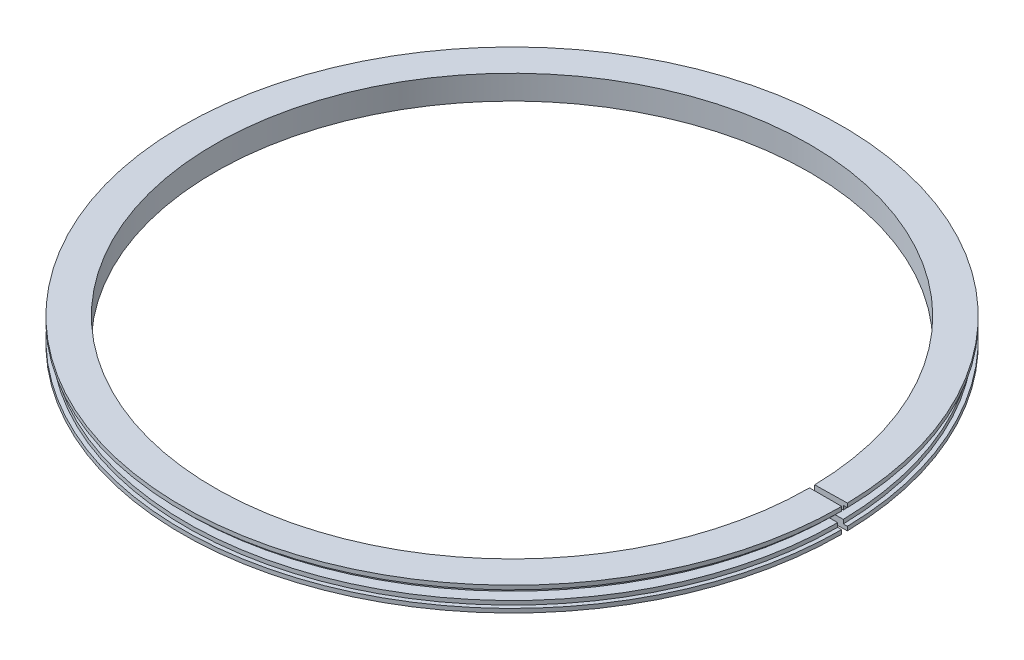
ISO-10303-21;
HEADER;
FILE_DESCRIPTION(('STEP AP214'),'2;1');
FILE_NAME('part.step','',(''),(''),'','','');
FILE_SCHEMA(('AUTOMOTIVE_DESIGN { 1 0 10303 214 1 1 1 1 }'));
ENDSEC;
DATA;
#1=APPLICATION_CONTEXT('core data for automotive mechanical design processes');
#2=APPLICATION_PROTOCOL_DEFINITION('international standard','automotive_design',2000,#1);
#3=PRODUCT_CONTEXT('',#1,'mechanical');
#4=PRODUCT('Part','Part','',(#3));
#5=PRODUCT_RELATED_PRODUCT_CATEGORY('part','',(#4));
#6=PRODUCT_DEFINITION_FORMATION('','',#4);
#7=PRODUCT_DEFINITION_CONTEXT('part definition',#1,'design');
#8=PRODUCT_DEFINITION('design','',#6,#7);
#9=PRODUCT_DEFINITION_SHAPE('','',#8);
#10=(LENGTH_UNIT() NAMED_UNIT(*) SI_UNIT(.MILLI.,.METRE.));
#11=(NAMED_UNIT(*) PLANE_ANGLE_UNIT() SI_UNIT($,.RADIAN.));
#12=(NAMED_UNIT(*) SI_UNIT($,.STERADIAN.) SOLID_ANGLE_UNIT());
#13=UNCERTAINTY_MEASURE_WITH_UNIT(LENGTH_MEASURE(1.E-05),#10,'distance_accuracy_value','');
#14=(GEOMETRIC_REPRESENTATION_CONTEXT(3) GLOBAL_UNCERTAINTY_ASSIGNED_CONTEXT((#13)) GLOBAL_UNIT_ASSIGNED_CONTEXT((#10,
#11,#12)) REPRESENTATION_CONTEXT('',''));
#15=CARTESIAN_POINT('',(0.,0.,0.));
#16=DIRECTION('',(0.,0.,1.));
#17=DIRECTION('',(1.,0.,0.));
#18=AXIS2_PLACEMENT_3D('',#15,#16,#17);
#19=CARTESIAN_POINT('',(38.4941362635211,2.,-0.67191764783487));
#20=DIRECTION('',(0.,1.,0.));
#21=DIRECTION('',(0.,0.,1.));
#22=AXIS2_PLACEMENT_3D('',#19,#20,#21);
#23=PLANE('',#22);
#24=CARTESIAN_POINT('',(0.,2.,0.));
#25=DIRECTION('',(0.,1.,0.));
#26=DIRECTION('',(0.,0.,1.));
#27=AXIS2_PLACEMENT_3D('',#24,#25,#26);
#28=CIRCLE('',#27,38.5);
#29=CARTESIAN_POINT('',(38.4941362635211,2.,-0.67191764783487));
#30=VERTEX_POINT('',#29);
#31=CARTESIAN_POINT('',(38.5,2.,0.));
#32=VERTEX_POINT('',#31);
#33=EDGE_CURVE('E11',#30,#32,#28,.T.);
#34=ORIENTED_EDGE('',*,*,#33,.T.);
#35=DIRECTION('',(1.,0.,0.));
#36=VECTOR('',#35,1.);
#37=CARTESIAN_POINT('',(38.5,2.,0.));
#38=LINE('',#37,#36);
#39=CARTESIAN_POINT('',(40.5,2.,0.));
#40=VERTEX_POINT('',#39);
#41=EDGE_CURVE('E149',#32,#40,#38,.T.);
#42=ORIENTED_EDGE('',*,*,#41,.T.);
#43=CARTESIAN_POINT('',(0.,2.,0.));
#44=DIRECTION('',(0.,1.,0.));
#45=DIRECTION('',(0.,0.,1.));
#46=AXIS2_PLACEMENT_3D('',#43,#44,#45);
#47=CIRCLE('',#46,40.5);
#48=CARTESIAN_POINT('',(40.4938316538339,2.,-0.706822460709409));
#49=VERTEX_POINT('',#48);
#50=EDGE_CURVE('E130',#49,#40,#47,.T.);
#51=ORIENTED_EDGE('',*,*,#50,.F.);
#52=DIRECTION('',(0.999847695156391,0.,-0.0174524064372693));
#53=VECTOR('',#52,1.);
#54=CARTESIAN_POINT('',(38.4941362635211,2.,-0.67191764783487));
#55=LINE('',#54,#53);
#56=EDGE_CURVE('E195',#30,#49,#55,.T.);
#57=ORIENTED_EDGE('',*,*,#56,.F.);
#58=EDGE_LOOP('',(#34,#42,#51,#57));
#59=FACE_BOUND('',#58,.T.);
#60=ADVANCED_FACE('F41',(#59),#23,.F.);
#61=CARTESIAN_POINT('',(0.,14.4931348475547,0.));
#62=DIRECTION('',(0.,1.,0.));
#63=DIRECTION('',(0.,0.,1.));
#64=AXIS2_PLACEMENT_3D('',#61,#62,#63);
#65=CYLINDRICAL_SURFACE('',#64,38.5);
#66=CARTESIAN_POINT('',(0.,1.,0.));
#67=DIRECTION('',(0.,1.,0.));
#68=DIRECTION('',(0.,0.,1.));
#69=AXIS2_PLACEMENT_3D('',#66,#67,#68);
#70=CIRCLE('',#69,38.5);
#71=CARTESIAN_POINT('',(38.4941362635211,1.,-0.67191764783487));
#72=VERTEX_POINT('',#71);
#73=CARTESIAN_POINT('',(38.5,1.,0.));
#74=VERTEX_POINT('',#73);
#75=EDGE_CURVE('E50',#72,#74,#70,.T.);
#76=ORIENTED_EDGE('',*,*,#75,.T.);
#77=DIRECTION('',(0.,1.,0.));
#78=VECTOR('',#77,1.);
#79=CARTESIAN_POINT('',(38.5,2.,0.));
#80=LINE('',#79,#78);
#81=EDGE_CURVE('E192',#74,#32,#80,.T.);
#82=ORIENTED_EDGE('',*,*,#81,.T.);
#83=ORIENTED_EDGE('',*,*,#33,.F.);
#84=DIRECTION('',(0.,1.,0.));
#85=VECTOR('',#84,1.);
#86=CARTESIAN_POINT('',(38.4941362635211,2.,-0.67191764783487));
#87=LINE('',#86,#85);
#88=EDGE_CURVE('E143',#72,#30,#87,.T.);
#89=ORIENTED_EDGE('',*,*,#88,.F.);
#90=EDGE_LOOP('',(#76,#82,#83,#89));
#91=FACE_BOUND('',#90,.T.);
#92=ADVANCED_FACE('F43',(#91),#65,.T.);
#93=CARTESIAN_POINT('',(38.4941362635211,1.,-0.67191764783487));
#94=DIRECTION('',(0.,-1.,0.));
#95=DIRECTION('',(0.,0.,-1.));
#96=AXIS2_PLACEMENT_3D('',#93,#94,#95);
#97=PLANE('',#96);
#98=CARTESIAN_POINT('',(0.,1.,0.));
#99=DIRECTION('',(0.,1.,0.));
#100=DIRECTION('',(0.,0.,1.));
#101=AXIS2_PLACEMENT_3D('',#98,#99,#100);
#102=CIRCLE('',#101,40.5);
#103=CARTESIAN_POINT('',(40.4938316538339,1.,-0.706822460709409));
#104=VERTEX_POINT('',#103);
#105=CARTESIAN_POINT('',(40.5,1.,0.));
#106=VERTEX_POINT('',#105);
#107=EDGE_CURVE('E260',#104,#106,#102,.T.);
#108=ORIENTED_EDGE('',*,*,#107,.T.);
#109=DIRECTION('',(-1.,0.,0.));
#110=VECTOR('',#109,1.);
#111=CARTESIAN_POINT('',(38.5,1.,0.));
#112=LINE('',#111,#110);
#113=EDGE_CURVE('E189',#106,#74,#112,.T.);
#114=ORIENTED_EDGE('',*,*,#113,.T.);
#115=ORIENTED_EDGE('',*,*,#75,.F.);
#116=DIRECTION('',(-0.999847695156391,0.,0.0174524064372693));
#117=VECTOR('',#116,1.);
#118=CARTESIAN_POINT('',(38.4941362635211,1.,-0.67191764783487));
#119=LINE('',#118,#117);
#120=EDGE_CURVE('E232',#104,#72,#119,.T.);
#121=ORIENTED_EDGE('',*,*,#120,.F.);
#122=EDGE_LOOP('',(#108,#114,#115,#121));
#123=FACE_BOUND('',#122,.T.);
#124=ADVANCED_FACE('F265',(#123),#97,.F.);
#125=CARTESIAN_POINT('',(0.,14.4931348475547,0.));
#126=DIRECTION('',(0.,1.,0.));
#127=DIRECTION('',(0.,0.,1.));
#128=AXIS2_PLACEMENT_3D('',#125,#126,#127);
#129=CYLINDRICAL_SURFACE('',#128,40.5);
#130=CARTESIAN_POINT('',(0.,0.5,0.));
#131=DIRECTION('',(0.,1.,0.));
#132=DIRECTION('',(0.,0.,1.));
#133=AXIS2_PLACEMENT_3D('',#130,#131,#132);
#134=CIRCLE('',#133,40.5);
#135=CARTESIAN_POINT('',(40.4938316538339,0.500000000000001,-0.706822460709409));
#136=VERTEX_POINT('',#135);
#137=CARTESIAN_POINT('',(40.5,0.500000000000001,0.));
#138=VERTEX_POINT('',#137);
#139=EDGE_CURVE('E257',#136,#138,#134,.T.);
#140=ORIENTED_EDGE('',*,*,#139,.T.);
#141=DIRECTION('',(0.,1.,0.));
#142=VECTOR('',#141,1.);
#143=CARTESIAN_POINT('',(40.5,1.,0.));
#144=LINE('',#143,#142);
#145=EDGE_CURVE('E185',#138,#106,#144,.T.);
#146=ORIENTED_EDGE('',*,*,#145,.T.);
#147=ORIENTED_EDGE('',*,*,#107,.F.);
#148=DIRECTION('',(0.,1.,0.));
#149=VECTOR('',#148,1.);
#150=CARTESIAN_POINT('',(40.4938316538339,1.,-0.706822460709409));
#151=LINE('',#150,#149);
#152=EDGE_CURVE('E228',#136,#104,#151,.T.);
#153=ORIENTED_EDGE('',*,*,#152,.F.);
#154=EDGE_LOOP('',(#140,#146,#147,#153));
#155=FACE_BOUND('',#154,.T.);
#156=ADVANCED_FACE('F270',(#155),#129,.T.);
#157=CARTESIAN_POINT('',(40.4938316538339,0.500000000000001,-0.706822460709409));
#158=DIRECTION('',(0.,-1.,0.));
#159=DIRECTION('',(0.,0.,-1.));
#160=AXIS2_PLACEMENT_3D('',#157,#158,#159);
#161=PLANE('',#160);
#162=CARTESIAN_POINT('',(0.,0.5,0.));
#163=DIRECTION('',(0.,1.,0.));
#164=DIRECTION('',(0.,0.,1.));
#165=AXIS2_PLACEMENT_3D('',#162,#163,#164);
#166=CIRCLE('',#165,41.);
#167=CARTESIAN_POINT('',(40.993755501412,0.500000000000001,-0.715548663928043));
#168=VERTEX_POINT('',#167);
#169=CARTESIAN_POINT('',(41.,0.500000000000001,0.));
#170=VERTEX_POINT('',#169);
#171=EDGE_CURVE('E254',#168,#170,#166,.T.);
#172=ORIENTED_EDGE('',*,*,#171,.T.);
#173=DIRECTION('',(-1.,0.,0.));
#174=VECTOR('',#173,1.);
#175=CARTESIAN_POINT('',(40.5,0.500000000000001,0.));
#176=LINE('',#175,#174);
#177=EDGE_CURVE('E181',#170,#138,#176,.T.);
#178=ORIENTED_EDGE('',*,*,#177,.T.);
#179=ORIENTED_EDGE('',*,*,#139,.F.);
#180=DIRECTION('',(-0.999847695156391,0.,0.0174524064372693));
#181=VECTOR('',#180,1.);
#182=CARTESIAN_POINT('',(40.4938316538339,0.500000000000001,-0.706822460709409));
#183=LINE('',#182,#181);
#184=EDGE_CURVE('E224',#168,#136,#183,.T.);
#185=ORIENTED_EDGE('',*,*,#184,.F.);
#186=EDGE_LOOP('',(#172,#178,#179,#185));
#187=FACE_BOUND('',#186,.T.);
#188=ADVANCED_FACE('F274',(#187),#161,.F.);
#189=CARTESIAN_POINT('',(0.,14.4931348475547,0.));
#190=DIRECTION('',(0.,1.,0.));
#191=DIRECTION('',(0.,0.,1.));
#192=AXIS2_PLACEMENT_3D('',#189,#190,#191);
#193=CYLINDRICAL_SURFACE('',#192,41.);
#194=CARTESIAN_POINT('',(0.,0.,0.));
#195=DIRECTION('',(0.,1.,0.));
#196=DIRECTION('',(0.,0.,1.));
#197=AXIS2_PLACEMENT_3D('',#194,#195,#196);
#198=CIRCLE('',#197,41.);
#199=CARTESIAN_POINT('',(40.993755501412,0.,-0.715548663928043));
#200=VERTEX_POINT('',#199);
#201=CARTESIAN_POINT('',(41.,0.,0.));
#202=VERTEX_POINT('',#201);
#203=EDGE_CURVE('E251',#200,#202,#198,.T.);
#204=ORIENTED_EDGE('',*,*,#203,.T.);
#205=DIRECTION('',(0.,1.,0.));
#206=VECTOR('',#205,1.);
#207=CARTESIAN_POINT('',(41.,0.500000000000001,0.));
#208=LINE('',#207,#206);
#209=EDGE_CURVE('E177',#202,#170,#208,.T.);
#210=ORIENTED_EDGE('',*,*,#209,.T.);
#211=ORIENTED_EDGE('',*,*,#171,.F.);
#212=DIRECTION('',(0.,1.,0.));
#213=VECTOR('',#212,1.);
#214=CARTESIAN_POINT('',(40.993755501412,0.500000000000001,-0.715548663928043));
#215=LINE('',#214,#213);
#216=EDGE_CURVE('E220',#200,#168,#215,.T.);
#217=ORIENTED_EDGE('',*,*,#216,.F.);
#218=EDGE_LOOP('',(#204,#210,#211,#217));
#219=FACE_BOUND('',#218,.T.);
#220=ADVANCED_FACE('F277',(#219),#193,.T.);
#221=CARTESIAN_POINT('',(36.9943647207865,0.,-0.645739038178966));
#222=DIRECTION('',(0.,1.,0.));
#223=DIRECTION('',(0.,0.,1.));
#224=AXIS2_PLACEMENT_3D('',#221,#222,#223);
#225=PLANE('',#224);
#226=CARTESIAN_POINT('',(0.,0.,0.));
#227=DIRECTION('',(0.,1.,0.));
#228=DIRECTION('',(0.,0.,1.));
#229=AXIS2_PLACEMENT_3D('',#226,#227,#228);
#230=CIRCLE('',#229,37.);
#231=CARTESIAN_POINT('',(36.9943647207865,0.,-0.645739038178966));
#232=VERTEX_POINT('',#231);
#233=CARTESIAN_POINT('',(37.,0.,0.));
#234=VERTEX_POINT('',#233);
#235=EDGE_CURVE('E248',#232,#234,#230,.T.);
#236=ORIENTED_EDGE('',*,*,#235,.T.);
#237=DIRECTION('',(1.,0.,0.));
#238=VECTOR('',#237,1.);
#239=CARTESIAN_POINT('',(37.,0.,0.));
#240=LINE('',#239,#238);
#241=EDGE_CURVE('E173',#234,#202,#240,.T.);
#242=ORIENTED_EDGE('',*,*,#241,.T.);
#243=ORIENTED_EDGE('',*,*,#203,.F.);
#244=DIRECTION('',(0.999847695156391,0.,-0.0174524064372693));
#245=VECTOR('',#244,1.);
#246=CARTESIAN_POINT('',(36.9943647207865,0.,-0.645739038178966));
#247=LINE('',#246,#245);
#248=EDGE_CURVE('E216',#232,#200,#247,.T.);
#249=ORIENTED_EDGE('',*,*,#248,.F.);
#250=EDGE_LOOP('',(#236,#242,#243,#249));
#251=FACE_BOUND('',#250,.T.);
#252=ADVANCED_FACE('F282',(#251),#225,.F.);
#253=CARTESIAN_POINT('',(0.,14.4931348475547,0.));
#254=DIRECTION('',(0.,1.,0.));
#255=DIRECTION('',(0.,0.,1.));
#256=AXIS2_PLACEMENT_3D('',#253,#254,#255);
#257=CYLINDRICAL_SURFACE('',#256,37.);
#258=CARTESIAN_POINT('',(0.,3.,0.));
#259=DIRECTION('',(0.,1.,0.));
#260=DIRECTION('',(0.,0.,1.));
#261=AXIS2_PLACEMENT_3D('',#258,#259,#260);
#262=CIRCLE('',#261,37.);
#263=CARTESIAN_POINT('',(36.9943647207865,3.,-0.645739038178966));
#264=VERTEX_POINT('',#263);
#265=CARTESIAN_POINT('',(37.,3.,0.));
#266=VERTEX_POINT('',#265);
#267=EDGE_CURVE('E245',#264,#266,#262,.T.);
#268=ORIENTED_EDGE('',*,*,#267,.T.);
#269=DIRECTION('',(0.,-1.,0.));
#270=VECTOR('',#269,1.);
#271=CARTESIAN_POINT('',(37.,3.,0.));
#272=LINE('',#271,#270);
#273=EDGE_CURVE('E169',#266,#234,#272,.T.);
#274=ORIENTED_EDGE('',*,*,#273,.T.);
#275=ORIENTED_EDGE('',*,*,#235,.F.);
#276=DIRECTION('',(0.,-1.,0.));
#277=VECTOR('',#276,1.);
#278=CARTESIAN_POINT('',(36.9943647207865,3.,-0.645739038178966));
#279=LINE('',#278,#277);
#280=EDGE_CURVE('E212',#264,#232,#279,.T.);
#281=ORIENTED_EDGE('',*,*,#280,.F.);
#282=EDGE_LOOP('',(#268,#274,#275,#281));
#283=FACE_BOUND('',#282,.T.);
#284=ADVANCED_FACE('F286',(#283),#257,.F.);
#285=CARTESIAN_POINT('',(36.9943647207865,3.,-0.645739038178966));
#286=DIRECTION('',(0.,-1.,0.));
#287=DIRECTION('',(0.,0.,-1.));
#288=AXIS2_PLACEMENT_3D('',#285,#286,#287);
#289=PLANE('',#288);
#290=CARTESIAN_POINT('',(0.,3.,0.));
#291=DIRECTION('',(0.,1.,0.));
#292=DIRECTION('',(0.,0.,1.));
#293=AXIS2_PLACEMENT_3D('',#290,#291,#292);
#294=CIRCLE('',#293,41.);
#295=CARTESIAN_POINT('',(40.993755501412,3.,-0.715548663928043));
#296=VERTEX_POINT('',#295);
#297=CARTESIAN_POINT('',(41.,3.,0.));
#298=VERTEX_POINT('',#297);
#299=EDGE_CURVE('E242',#296,#298,#294,.T.);
#300=ORIENTED_EDGE('',*,*,#299,.T.);
#301=DIRECTION('',(-1.,0.,0.));
#302=VECTOR('',#301,1.);
#303=CARTESIAN_POINT('',(37.,3.,0.));
#304=LINE('',#303,#302);
#305=EDGE_CURVE('E165',#298,#266,#304,.T.);
#306=ORIENTED_EDGE('',*,*,#305,.T.);
#307=ORIENTED_EDGE('',*,*,#267,.F.);
#308=DIRECTION('',(-0.999847695156391,0.,0.0174524064372693));
#309=VECTOR('',#308,1.);
#310=CARTESIAN_POINT('',(36.9943647207865,3.,-0.645739038178966));
#311=LINE('',#310,#309);
#312=EDGE_CURVE('E208',#296,#264,#311,.T.);
#313=ORIENTED_EDGE('',*,*,#312,.F.);
#314=EDGE_LOOP('',(#300,#306,#307,#313));
#315=FACE_BOUND('',#314,.T.);
#316=ADVANCED_FACE('F289',(#315),#289,.F.);
#317=CARTESIAN_POINT('',(0.,14.4931348475547,0.));
#318=DIRECTION('',(0.,1.,0.));
#319=DIRECTION('',(0.,0.,1.));
#320=AXIS2_PLACEMENT_3D('',#317,#318,#319);
#321=CYLINDRICAL_SURFACE('',#320,41.);
#322=CARTESIAN_POINT('',(0.,2.5,0.));
#323=DIRECTION('',(0.,1.,0.));
#324=DIRECTION('',(0.,0.,1.));
#325=AXIS2_PLACEMENT_3D('',#322,#323,#324);
#326=CIRCLE('',#325,41.);
#327=CARTESIAN_POINT('',(40.993755501412,2.5,-0.715548663928043));
#328=VERTEX_POINT('',#327);
#329=CARTESIAN_POINT('',(41.,2.5,0.));
#330=VERTEX_POINT('',#329);
#331=EDGE_CURVE('E239',#328,#330,#326,.T.);
#332=ORIENTED_EDGE('',*,*,#331,.T.);
#333=DIRECTION('',(0.,1.,0.));
#334=VECTOR('',#333,1.);
#335=CARTESIAN_POINT('',(41.,3.,0.));
#336=LINE('',#335,#334);
#337=EDGE_CURVE('E161',#330,#298,#336,.T.);
#338=ORIENTED_EDGE('',*,*,#337,.T.);
#339=ORIENTED_EDGE('',*,*,#299,.F.);
#340=DIRECTION('',(0.,1.,0.));
#341=VECTOR('',#340,1.);
#342=CARTESIAN_POINT('',(40.993755501412,3.,-0.715548663928043));
#343=LINE('',#342,#341);
#344=EDGE_CURVE('E204',#328,#296,#343,.T.);
#345=ORIENTED_EDGE('',*,*,#344,.F.);
#346=EDGE_LOOP('',(#332,#338,#339,#345));
#347=FACE_BOUND('',#346,.T.);
#348=ADVANCED_FACE('F291',(#347),#321,.T.);
#349=CARTESIAN_POINT('',(40.4938316538339,2.5,-0.706822460709409));
#350=DIRECTION('',(0.,1.,0.));
#351=DIRECTION('',(0.,0.,1.));
#352=AXIS2_PLACEMENT_3D('',#349,#350,#351);
#353=PLANE('',#352);
#354=CARTESIAN_POINT('',(0.,2.5,0.));
#355=DIRECTION('',(0.,1.,0.));
#356=DIRECTION('',(0.,0.,1.));
#357=AXIS2_PLACEMENT_3D('',#354,#355,#356);
#358=CIRCLE('',#357,40.5);
#359=CARTESIAN_POINT('',(40.4938316538339,2.5,-0.706822460709409));
#360=VERTEX_POINT('',#359);
#361=CARTESIAN_POINT('',(40.5,2.5,0.));
#362=VERTEX_POINT('',#361);
#363=EDGE_CURVE('E142',#360,#362,#358,.T.);
#364=ORIENTED_EDGE('',*,*,#363,.T.);
#365=DIRECTION('',(1.,0.,0.));
#366=VECTOR('',#365,1.);
#367=CARTESIAN_POINT('',(40.5,2.5,0.));
#368=LINE('',#367,#366);
#369=EDGE_CURVE('E152',#362,#330,#368,.T.);
#370=ORIENTED_EDGE('',*,*,#369,.T.);
#371=ORIENTED_EDGE('',*,*,#331,.F.);
#372=DIRECTION('',(0.999847695156391,0.,-0.0174524064372693));
#373=VECTOR('',#372,1.);
#374=CARTESIAN_POINT('',(40.4938316538339,2.5,-0.706822460709409));
#375=LINE('',#374,#373);
#376=EDGE_CURVE('E200',#360,#328,#375,.T.);
#377=ORIENTED_EDGE('',*,*,#376,.F.);
#378=EDGE_LOOP('',(#364,#370,#371,#377));
#379=FACE_BOUND('',#378,.T.);
#380=ADVANCED_FACE('F295',(#379),#353,.F.);
#381=CARTESIAN_POINT('',(0.,14.4931348475547,0.));
#382=DIRECTION('',(0.,1.,0.));
#383=DIRECTION('',(0.,0.,1.));
#384=AXIS2_PLACEMENT_3D('',#381,#382,#383);
#385=CYLINDRICAL_SURFACE('',#384,40.5);
#386=DIRECTION('',(0.,1.,0.));
#387=VECTOR('',#386,1.);
#388=CARTESIAN_POINT('',(40.4938316538339,2.5,-0.706822460709409));
#389=LINE('',#388,#387);
#390=EDGE_CURVE('E136',#49,#360,#389,.T.);
#391=ORIENTED_EDGE('',*,*,#390,.F.);
#392=ORIENTED_EDGE('',*,*,#50,.T.);
#393=DIRECTION('',(0.,1.,0.));
#394=VECTOR('',#393,1.);
#395=CARTESIAN_POINT('',(40.5,2.5,0.));
#396=LINE('',#395,#394);
#397=EDGE_CURVE('E133',#40,#362,#396,.T.);
#398=ORIENTED_EDGE('',*,*,#397,.T.);
#399=ORIENTED_EDGE('',*,*,#363,.F.);
#400=EDGE_LOOP('',(#391,#392,#398,#399));
#401=FACE_BOUND('',#400,.T.);
#402=ADVANCED_FACE('F132',(#401),#385,.T.);
#403=CARTESIAN_POINT('',(40.4938316538339,2.,-0.706822460709409));
#404=DIRECTION('',(-0.0174524064372693,0.,-0.999847695156391));
#405=DIRECTION('',(-0.999847695156391,0.,0.0174524064372693));
#406=AXIS2_PLACEMENT_3D('',#403,#404,#405);
#407=PLANE('',#406);
#408=ORIENTED_EDGE('',*,*,#56,.T.);
#409=ORIENTED_EDGE('',*,*,#390,.T.);
#410=ORIENTED_EDGE('',*,*,#376,.T.);
#411=ORIENTED_EDGE('',*,*,#344,.T.);
#412=ORIENTED_EDGE('',*,*,#312,.T.);
#413=ORIENTED_EDGE('',*,*,#280,.T.);
#414=ORIENTED_EDGE('',*,*,#248,.T.);
#415=ORIENTED_EDGE('',*,*,#216,.T.);
#416=ORIENTED_EDGE('',*,*,#184,.T.);
#417=ORIENTED_EDGE('',*,*,#152,.T.);
#418=ORIENTED_EDGE('',*,*,#120,.T.);
#419=ORIENTED_EDGE('',*,*,#88,.T.);
#420=EDGE_LOOP('',(#408,#409,#410,#411,#412,#413,#414,#415,#416,#417,#418,#419));
#421=FACE_BOUND('',#420,.T.);
#422=ADVANCED_FACE('F297',(#421),#407,.F.);
#423=CARTESIAN_POINT('',(40.5,2.,0.));
#424=DIRECTION('',(0.,0.,-1.));
#425=DIRECTION('',(-1.,0.,0.));
#426=AXIS2_PLACEMENT_3D('',#423,#424,#425);
#427=PLANE('',#426);
#428=ORIENTED_EDGE('',*,*,#41,.F.);
#429=ORIENTED_EDGE('',*,*,#81,.F.);
#430=ORIENTED_EDGE('',*,*,#113,.F.);
#431=ORIENTED_EDGE('',*,*,#145,.F.);
#432=ORIENTED_EDGE('',*,*,#177,.F.);
#433=ORIENTED_EDGE('',*,*,#209,.F.);
#434=ORIENTED_EDGE('',*,*,#241,.F.);
#435=ORIENTED_EDGE('',*,*,#273,.F.);
#436=ORIENTED_EDGE('',*,*,#305,.F.);
#437=ORIENTED_EDGE('',*,*,#337,.F.);
#438=ORIENTED_EDGE('',*,*,#369,.F.);
#439=ORIENTED_EDGE('',*,*,#397,.F.);
#440=EDGE_LOOP('',(#428,#429,#430,#431,#432,#433,#434,#435,#436,#437,#438,#439));
#441=FACE_BOUND('',#440,.T.);
#442=ADVANCED_FACE('F147',(#441),#427,.T.);
#443=CLOSED_SHELL('',(#60,#92,#124,#156,#188,#220,#252,#284,#316,#348,#380,#402,#422,#442));
#444=MANIFOLD_SOLID_BREP('B2',#443);
#445=ADVANCED_BREP_SHAPE_REPRESENTATION('',(#18,#444),#14);
#446=SHAPE_DEFINITION_REPRESENTATION(#9,#445);
ENDSEC;
END-ISO-10303-21;
